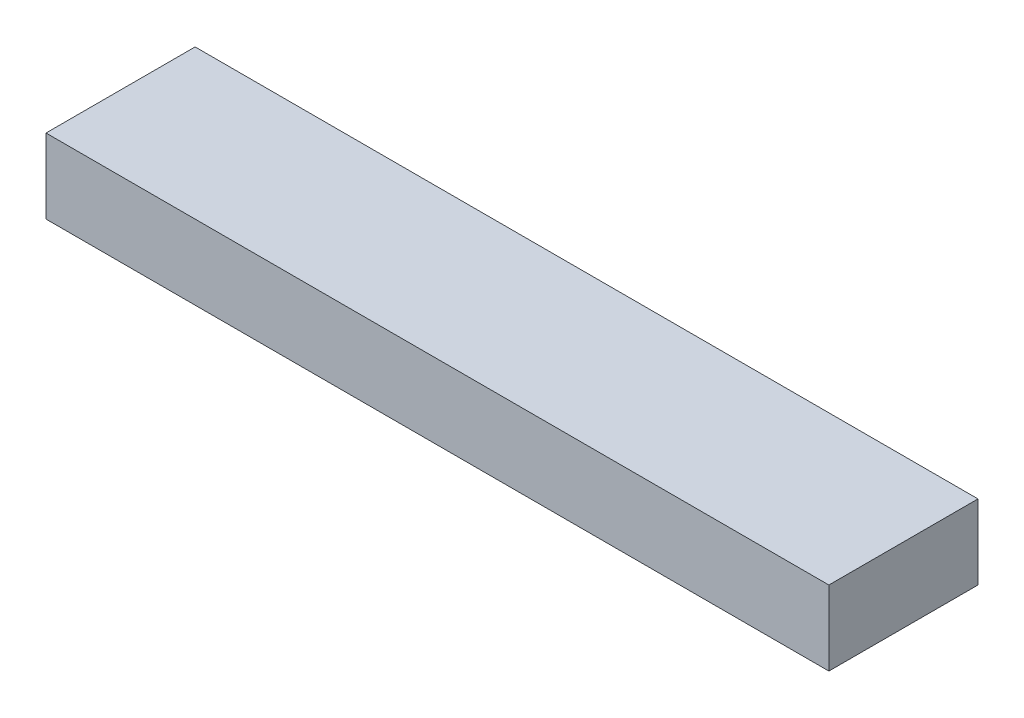
ISO-10303-21;
HEADER;
FILE_DESCRIPTION(('STEP AP214'),'2;1');
FILE_NAME('part.step','',(''),(''),'','','');
FILE_SCHEMA(('AUTOMOTIVE_DESIGN { 1 0 10303 214 1 1 1 1 }'));
ENDSEC;
DATA;
#1=APPLICATION_CONTEXT('core data for automotive mechanical design processes');
#2=APPLICATION_PROTOCOL_DEFINITION('international standard','automotive_design',2000,#1);
#3=PRODUCT_CONTEXT('',#1,'mechanical');
#4=PRODUCT('Part','Part','',(#3));
#5=PRODUCT_RELATED_PRODUCT_CATEGORY('part','',(#4));
#6=PRODUCT_DEFINITION_FORMATION('','',#4);
#7=PRODUCT_DEFINITION_CONTEXT('part definition',#1,'design');
#8=PRODUCT_DEFINITION('design','',#6,#7);
#9=PRODUCT_DEFINITION_SHAPE('','',#8);
#10=(LENGTH_UNIT() NAMED_UNIT(*) SI_UNIT(.MILLI.,.METRE.));
#11=(NAMED_UNIT(*) PLANE_ANGLE_UNIT() SI_UNIT($,.RADIAN.));
#12=(NAMED_UNIT(*) SI_UNIT($,.STERADIAN.) SOLID_ANGLE_UNIT());
#13=UNCERTAINTY_MEASURE_WITH_UNIT(LENGTH_MEASURE(1.E-05),#10,'distance_accuracy_value','');
#14=(GEOMETRIC_REPRESENTATION_CONTEXT(3) GLOBAL_UNCERTAINTY_ASSIGNED_CONTEXT((#13)) GLOBAL_UNIT_ASSIGNED_CONTEXT((#10,
#11,#12)) REPRESENTATION_CONTEXT('',''));
#15=CARTESIAN_POINT('',(0.,0.,0.));
#16=DIRECTION('',(0.,0.,1.));
#17=DIRECTION('',(1.,0.,0.));
#18=AXIS2_PLACEMENT_3D('',#15,#16,#17);
#19=CARTESIAN_POINT('',(-0.525000000000001,0.1,0.0999999999999999));
#20=DIRECTION('',(1.,0.,0.));
#21=DIRECTION('',(0.,0.,-1.));
#22=AXIS2_PLACEMENT_3D('',#19,#20,#21);
#23=PLANE('',#22);
#24=DIRECTION('',(0.,0.,1.));
#25=VECTOR('',#24,1.);
#26=CARTESIAN_POINT('',(-0.525000000000001,0.,0.0999999999999999));
#27=LINE('',#26,#25);
#28=CARTESIAN_POINT('',(-0.525000000000001,0.,-0.1));
#29=VERTEX_POINT('',#28);
#30=CARTESIAN_POINT('',(-0.525000000000001,0.,0.0999999999999999));
#31=VERTEX_POINT('',#30);
#32=EDGE_CURVE('E97',#29,#31,#27,.T.);
#33=ORIENTED_EDGE('',*,*,#32,.T.);
#34=DIRECTION('',(0.,-1.,0.));
#35=VECTOR('',#34,1.);
#36=CARTESIAN_POINT('',(-0.525000000000001,0.1,0.0999999999999999));
#37=LINE('',#36,#35);
#38=CARTESIAN_POINT('',(-0.525000000000001,0.1,0.0999999999999999));
#39=VERTEX_POINT('',#38);
#40=EDGE_CURVE('E11',#39,#31,#37,.T.);
#41=ORIENTED_EDGE('',*,*,#40,.F.);
#42=DIRECTION('',(0.,0.,1.));
#43=VECTOR('',#42,1.);
#44=CARTESIAN_POINT('',(-0.525000000000001,0.1,0.0999999999999999));
#45=LINE('',#44,#43);
#46=CARTESIAN_POINT('',(-0.525000000000001,0.1,-0.1));
#47=VERTEX_POINT('',#46);
#48=EDGE_CURVE('E85',#47,#39,#45,.T.);
#49=ORIENTED_EDGE('',*,*,#48,.F.);
#50=DIRECTION('',(0.,-1.,0.));
#51=VECTOR('',#50,1.);
#52=CARTESIAN_POINT('',(-0.525000000000001,0.1,-0.1));
#53=LINE('',#52,#51);
#54=EDGE_CURVE('E93',#47,#29,#53,.T.);
#55=ORIENTED_EDGE('',*,*,#54,.T.);
#56=EDGE_LOOP('',(#33,#41,#49,#55));
#57=FACE_BOUND('',#56,.T.);
#58=ADVANCED_FACE('F34',(#57),#23,.F.);
#59=CARTESIAN_POINT('',(0.524999999999999,0.1,0.0999999999999998));
#60=DIRECTION('',(0.,0.,-1.));
#61=DIRECTION('',(-1.,0.,0.));
#62=AXIS2_PLACEMENT_3D('',#59,#60,#61);
#63=PLANE('',#62);
#64=DIRECTION('',(1.,0.,0.));
#65=VECTOR('',#64,1.);
#66=CARTESIAN_POINT('',(0.524999999999999,0.,0.0999999999999998));
#67=LINE('',#66,#65);
#68=CARTESIAN_POINT('',(0.524999999999999,0.,0.0999999999999998));
#69=VERTEX_POINT('',#68);
#70=EDGE_CURVE('E89',#31,#69,#67,.T.);
#71=ORIENTED_EDGE('',*,*,#70,.T.);
#72=DIRECTION('',(0.,-1.,0.));
#73=VECTOR('',#72,1.);
#74=CARTESIAN_POINT('',(0.524999999999999,0.1,0.0999999999999998));
#75=LINE('',#74,#73);
#76=CARTESIAN_POINT('',(0.524999999999999,0.1,0.0999999999999998));
#77=VERTEX_POINT('',#76);
#78=EDGE_CURVE('E42',#77,#69,#75,.T.);
#79=ORIENTED_EDGE('',*,*,#78,.F.);
#80=DIRECTION('',(1.,0.,0.));
#81=VECTOR('',#80,1.);
#82=CARTESIAN_POINT('',(0.524999999999999,0.1,0.0999999999999998));
#83=LINE('',#82,#81);
#84=EDGE_CURVE('E80',#39,#77,#83,.T.);
#85=ORIENTED_EDGE('',*,*,#84,.F.);
#86=ORIENTED_EDGE('',*,*,#40,.T.);
#87=EDGE_LOOP('',(#71,#79,#85,#86));
#88=FACE_BOUND('',#87,.T.);
#89=ADVANCED_FACE('F88',(#88),#63,.F.);
#90=CARTESIAN_POINT('',(0.524999999999999,0.1,0.0999999999999998));
#91=DIRECTION('',(-1.,0.,0.));
#92=DIRECTION('',(0.,0.,1.));
#93=AXIS2_PLACEMENT_3D('',#90,#91,#92);
#94=PLANE('',#93);
#95=DIRECTION('',(0.,0.,-1.));
#96=VECTOR('',#95,1.);
#97=CARTESIAN_POINT('',(0.524999999999999,0.,0.0999999999999998));
#98=LINE('',#97,#96);
#99=CARTESIAN_POINT('',(0.524999999999999,0.,-0.1));
#100=VERTEX_POINT('',#99);
#101=EDGE_CURVE('E67',#69,#100,#98,.T.);
#102=ORIENTED_EDGE('',*,*,#101,.T.);
#103=DIRECTION('',(0.,-1.,0.));
#104=VECTOR('',#103,1.);
#105=CARTESIAN_POINT('',(0.524999999999999,0.1,-0.1));
#106=LINE('',#105,#104);
#107=CARTESIAN_POINT('',(0.524999999999999,0.1,-0.1));
#108=VERTEX_POINT('',#107);
#109=EDGE_CURVE('E90',#108,#100,#106,.T.);
#110=ORIENTED_EDGE('',*,*,#109,.F.);
#111=DIRECTION('',(0.,0.,-1.));
#112=VECTOR('',#111,1.);
#113=CARTESIAN_POINT('',(0.524999999999999,0.1,0.0999999999999998));
#114=LINE('',#113,#112);
#115=EDGE_CURVE('E83',#77,#108,#114,.T.);
#116=ORIENTED_EDGE('',*,*,#115,.F.);
#117=ORIENTED_EDGE('',*,*,#78,.T.);
#118=EDGE_LOOP('',(#102,#110,#116,#117));
#119=FACE_BOUND('',#118,.T.);
#120=ADVANCED_FACE('F91',(#119),#94,.F.);
#121=CARTESIAN_POINT('',(0.524999999999999,0.1,-0.1));
#122=DIRECTION('',(0.,0.,1.));
#123=DIRECTION('',(1.,0.,0.));
#124=AXIS2_PLACEMENT_3D('',#121,#122,#123);
#125=PLANE('',#124);
#126=DIRECTION('',(-1.,0.,0.));
#127=VECTOR('',#126,1.);
#128=CARTESIAN_POINT('',(0.524999999999999,0.,-0.1));
#129=LINE('',#128,#127);
#130=EDGE_CURVE('E73',#100,#29,#129,.T.);
#131=ORIENTED_EDGE('',*,*,#130,.T.);
#132=ORIENTED_EDGE('',*,*,#54,.F.);
#133=DIRECTION('',(-1.,0.,0.));
#134=VECTOR('',#133,1.);
#135=CARTESIAN_POINT('',(0.524999999999999,0.1,-0.1));
#136=LINE('',#135,#134);
#137=EDGE_CURVE('E50',#108,#47,#136,.T.);
#138=ORIENTED_EDGE('',*,*,#137,.F.);
#139=ORIENTED_EDGE('',*,*,#109,.T.);
#140=EDGE_LOOP('',(#131,#132,#138,#139));
#141=FACE_BOUND('',#140,.T.);
#142=ADVANCED_FACE('F104',(#141),#125,.F.);
#143=CARTESIAN_POINT('',(0.,0.1,0.));
#144=DIRECTION('',(0.,1.,0.));
#145=DIRECTION('',(0.,0.,1.));
#146=AXIS2_PLACEMENT_3D('',#143,#144,#145);
#147=PLANE('',#146);
#148=ORIENTED_EDGE('',*,*,#48,.T.);
#149=ORIENTED_EDGE('',*,*,#84,.T.);
#150=ORIENTED_EDGE('',*,*,#115,.T.);
#151=ORIENTED_EDGE('',*,*,#137,.T.);
#152=EDGE_LOOP('',(#148,#149,#150,#151));
#153=FACE_BOUND('',#152,.T.);
#154=ADVANCED_FACE('F81',(#153),#147,.T.);
#155=CARTESIAN_POINT('',(0.,0.,0.));
#156=DIRECTION('',(0.,1.,0.));
#157=DIRECTION('',(0.,0.,1.));
#158=AXIS2_PLACEMENT_3D('',#155,#156,#157);
#159=PLANE('',#158);
#160=ORIENTED_EDGE('',*,*,#32,.F.);
#161=ORIENTED_EDGE('',*,*,#130,.F.);
#162=ORIENTED_EDGE('',*,*,#101,.F.);
#163=ORIENTED_EDGE('',*,*,#70,.F.);
#164=EDGE_LOOP('',(#160,#161,#162,#163));
#165=FACE_BOUND('',#164,.T.);
#166=ADVANCED_FACE('F107',(#165),#159,.F.);
#167=CLOSED_SHELL('',(#58,#89,#120,#142,#154,#166));
#168=MANIFOLD_SOLID_BREP('B2',#167);
#169=ADVANCED_BREP_SHAPE_REPRESENTATION('',(#18,#168),#14);
#170=SHAPE_DEFINITION_REPRESENTATION(#9,#169);
ENDSEC;
END-ISO-10303-21;
